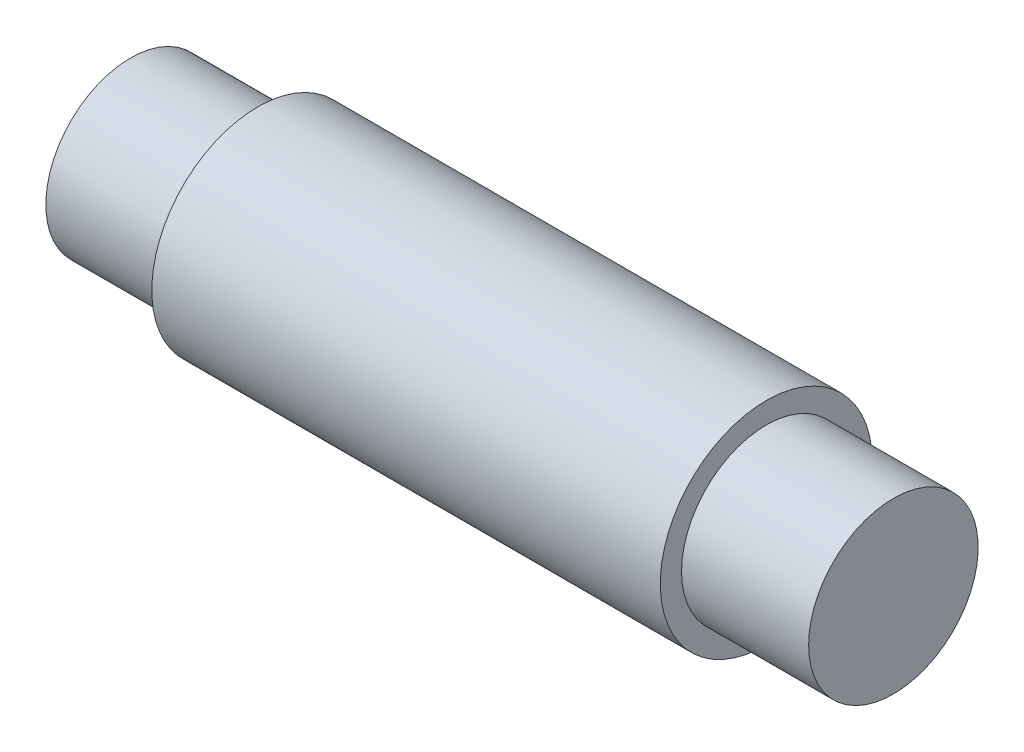
ISO-10303-21;
HEADER;
FILE_DESCRIPTION(('STEP AP214'),'2;1');
FILE_NAME('part.step','',(''),(''),'','','');
FILE_SCHEMA(('AUTOMOTIVE_DESIGN { 1 0 10303 214 1 1 1 1 }'));
ENDSEC;
DATA;
#1=APPLICATION_CONTEXT('core data for automotive mechanical design processes');
#2=APPLICATION_PROTOCOL_DEFINITION('international standard','automotive_design',2000,#1);
#3=PRODUCT_CONTEXT('',#1,'mechanical');
#4=PRODUCT('Part','Part','',(#3));
#5=PRODUCT_RELATED_PRODUCT_CATEGORY('part','',(#4));
#6=PRODUCT_DEFINITION_FORMATION('','',#4);
#7=PRODUCT_DEFINITION_CONTEXT('part definition',#1,'design');
#8=PRODUCT_DEFINITION('design','',#6,#7);
#9=PRODUCT_DEFINITION_SHAPE('','',#8);
#10=(LENGTH_UNIT() NAMED_UNIT(*) SI_UNIT(.MILLI.,.METRE.));
#11=(NAMED_UNIT(*) PLANE_ANGLE_UNIT() SI_UNIT($,.RADIAN.));
#12=(NAMED_UNIT(*) SI_UNIT($,.STERADIAN.) SOLID_ANGLE_UNIT());
#13=UNCERTAINTY_MEASURE_WITH_UNIT(LENGTH_MEASURE(1.E-05),#10,'distance_accuracy_value','');
#14=(GEOMETRIC_REPRESENTATION_CONTEXT(3) GLOBAL_UNCERTAINTY_ASSIGNED_CONTEXT((#13)) GLOBAL_UNIT_ASSIGNED_CONTEXT((#10,
#11,#12)) REPRESENTATION_CONTEXT('',''));
#15=CARTESIAN_POINT('',(0.,0.,0.));
#16=DIRECTION('',(0.,0.,1.));
#17=DIRECTION('',(1.,0.,0.));
#18=AXIS2_PLACEMENT_3D('',#15,#16,#17);
#19=CARTESIAN_POINT('',(2.38125,0.,0.));
#20=DIRECTION('',(-1.,0.,0.));
#21=DIRECTION('',(0.,0.,1.));
#22=AXIS2_PLACEMENT_3D('',#19,#20,#21);
#23=CYLINDRICAL_SURFACE('',#22,3.175);
#24=CARTESIAN_POINT('',(2.38125,0.,0.));
#25=DIRECTION('',(1.,0.,0.));
#26=DIRECTION('',(0.,0.,-1.));
#27=AXIS2_PLACEMENT_3D('',#24,#25,#26);
#28=CIRCLE('',#27,3.175);
#29=CARTESIAN_POINT('',(2.38125,0.,3.175));
#30=VERTEX_POINT('',#29);
#31=EDGE_CURVE('E45',#30,#30,#28,.T.);
#32=CARTESIAN_POINT('',(-2.38125,0.,0.));
#33=DIRECTION('',(1.,0.,0.));
#34=DIRECTION('',(0.,0.,-1.));
#35=AXIS2_PLACEMENT_3D('',#32,#33,#34);
#36=CIRCLE('',#35,3.175);
#37=CARTESIAN_POINT('',(-2.38125,0.,3.175));
#38=VERTEX_POINT('',#37);
#39=EDGE_CURVE('E40',#38,#38,#36,.T.);
#40=CARTESIAN_POINT('',(2.38125,0.,3.175));
#41=CARTESIAN_POINT('',(2.331640625,0.,3.175));
#42=CARTESIAN_POINT('',(2.28203125,0.,3.175));
#43=CARTESIAN_POINT('',(2.1828125,0.,3.175));
#44=CARTESIAN_POINT('',(2.133203125,0.,3.175));
#45=CARTESIAN_POINT('',(2.033984375,0.,3.175));
#46=CARTESIAN_POINT('',(1.984375,0.,3.175));
#47=CARTESIAN_POINT('',(1.88515625,0.,3.175));
#48=CARTESIAN_POINT('',(1.835546875,0.,3.175));
#49=CARTESIAN_POINT('',(1.736328125,0.,3.175));
#50=CARTESIAN_POINT('',(1.68671875,0.,3.175));
#51=CARTESIAN_POINT('',(1.5875,0.,3.175));
#52=CARTESIAN_POINT('',(1.537890625,0.,3.175));
#53=CARTESIAN_POINT('',(1.438671875,0.,3.175));
#54=CARTESIAN_POINT('',(1.3890625,0.,3.175));
#55=CARTESIAN_POINT('',(1.28984375,0.,3.175));
#56=CARTESIAN_POINT('',(1.240234375,0.,3.175));
#57=CARTESIAN_POINT('',(1.141015625,0.,3.175));
#58=CARTESIAN_POINT('',(1.09140625,0.,3.175));
#59=CARTESIAN_POINT('',(0.9921875,0.,3.175));
#60=CARTESIAN_POINT('',(0.942578125,0.,3.175));
#61=CARTESIAN_POINT('',(0.843359375,0.,3.175));
#62=CARTESIAN_POINT('',(0.79375,0.,3.175));
#63=CARTESIAN_POINT('',(0.69453125,0.,3.175));
#64=CARTESIAN_POINT('',(0.644921875,0.,3.175));
#65=CARTESIAN_POINT('',(0.545703125,0.,3.175));
#66=CARTESIAN_POINT('',(0.49609375,0.,3.175));
#67=CARTESIAN_POINT('',(0.396875,0.,3.175));
#68=CARTESIAN_POINT('',(0.347265625,0.,3.175));
#69=CARTESIAN_POINT('',(0.248046875,0.,3.175));
#70=CARTESIAN_POINT('',(0.1984375,0.,3.175));
#71=CARTESIAN_POINT('',(0.0992187499999996,0.,3.175));
#72=CARTESIAN_POINT('',(0.0496093749999996,0.,3.175));
#73=CARTESIAN_POINT('',(-0.0496093750000005,0.,3.175));
#74=CARTESIAN_POINT('',(-0.0992187500000005,0.,3.175));
#75=CARTESIAN_POINT('',(-0.198437500000001,0.,3.175));
#76=CARTESIAN_POINT('',(-0.248046875000001,0.,3.175));
#77=CARTESIAN_POINT('',(-0.347265625000001,0.,3.175));
#78=CARTESIAN_POINT('',(-0.396875000000001,0.,3.175));
#79=CARTESIAN_POINT('',(-0.496093750000001,0.,3.175));
#80=CARTESIAN_POINT('',(-0.545703125000001,0.,3.175));
#81=CARTESIAN_POINT('',(-0.644921875000001,0.,3.175));
#82=CARTESIAN_POINT('',(-0.694531250000001,0.,3.175));
#83=CARTESIAN_POINT('',(-0.793750000000001,0.,3.175));
#84=CARTESIAN_POINT('',(-0.843359375,0.,3.175));
#85=CARTESIAN_POINT('',(-0.942578125000001,0.,3.175));
#86=CARTESIAN_POINT('',(-0.992187500000001,0.,3.175));
#87=CARTESIAN_POINT('',(-1.09140625,0.,3.175));
#88=CARTESIAN_POINT('',(-1.141015625,0.,3.175));
#89=CARTESIAN_POINT('',(-1.240234375,0.,3.175));
#90=CARTESIAN_POINT('',(-1.28984375,0.,3.175));
#91=CARTESIAN_POINT('',(-1.3890625,0.,3.175));
#92=CARTESIAN_POINT('',(-1.438671875,0.,3.175));
#93=CARTESIAN_POINT('',(-1.537890625,0.,3.175));
#94=CARTESIAN_POINT('',(-1.5875,0.,3.175));
#95=CARTESIAN_POINT('',(-1.68671875,0.,3.175));
#96=CARTESIAN_POINT('',(-1.736328125,0.,3.175));
#97=CARTESIAN_POINT('',(-1.835546875,0.,3.175));
#98=CARTESIAN_POINT('',(-1.88515625,0.,3.175));
#99=CARTESIAN_POINT('',(-1.984375,0.,3.175));
#100=CARTESIAN_POINT('',(-2.033984375,0.,3.175));
#101=CARTESIAN_POINT('',(-2.133203125,0.,3.175));
#102=CARTESIAN_POINT('',(-2.1828125,0.,3.175));
#103=CARTESIAN_POINT('',(-2.28203125,0.,3.175));
#104=CARTESIAN_POINT('',(-2.331640625,0.,3.175));
#105=CARTESIAN_POINT('',(-2.38125,0.,3.175));
#106=B_SPLINE_CURVE_WITH_KNOTS('',3,(#40,#41,#42,#43,#44,#45,#46,#47,#48,#49,#50,#51,#52,#53,
#54,#55,#56,#57,#58,#59,#60,#61,#62,#63,#64,#65,#66,#67,#68,#69,#70,#71,#72,#73,#74,#75,#76,#77,
#78,#79,#80,#81,#82,#83,#84,#85,#86,#87,#88,#89,#90,#91,#92,#93,#94,#95,#96,#97,#98,#99,#100,
#101,#102,#103,#104,#105),.UNSPECIFIED.,.F.,.F.,(4,2,2,2,2,2,2,2,2,2,2,2,2,2,2,2,2,2,2,2,2,2,2,
2,2,2,2,2,2,2,2,2,4),(0.,0.148828125,0.29765625,0.446484375,0.5953125,0.744140625,0.89296875,
1.041796875,1.190625,1.339453125,1.48828125,1.637109375,1.7859375,1.934765625,2.08359375,
2.232421875,2.38125,2.530078125,2.67890625,2.827734375,2.9765625,3.125390625,3.27421875,
3.423046875,3.571875,3.720703125,3.86953125,4.018359375,4.1671875,4.316015625,4.46484375,
4.613671875,4.7625),.UNSPECIFIED.);
#107=EDGE_CURVE('BSEAM37',#30,#38,#106,.T.);
#108=ORIENTED_EDGE('',*,*,#31,.F.);
#109=ORIENTED_EDGE('',*,*,#39,.T.);
#110=ORIENTED_EDGE('',*,*,#107,.T.);
#111=ORIENTED_EDGE('',*,*,#107,.F.);
#112=EDGE_LOOP('',(#108,#110,#109,#111));
#113=FACE_BOUND('',#112,.T.);
#114=ADVANCED_FACE('F37',(#113),#23,.T.);
#115=CARTESIAN_POINT('',(2.38125,0.,0.));
#116=DIRECTION('',(1.,0.,0.));
#117=DIRECTION('',(0.,0.,-1.));
#118=AXIS2_PLACEMENT_3D('',#115,#116,#117);
#119=PLANE('',#118);
#120=ORIENTED_EDGE('',*,*,#31,.T.);
#121=EDGE_LOOP('',(#120));
#122=FACE_BOUND('',#121,.T.);
#123=ADVANCED_FACE('F83',(#122),#119,.T.);
#124=CARTESIAN_POINT('',(-21.43125,0.,0.));
#125=DIRECTION('',(1.,0.,0.));
#126=DIRECTION('',(0.,0.,-1.));
#127=AXIS2_PLACEMENT_3D('',#124,#125,#126);
#128=CYLINDRICAL_SURFACE('',#127,3.96875);
#129=CARTESIAN_POINT('',(-21.43125,0.,0.));
#130=DIRECTION('',(-1.,0.,0.));
#131=DIRECTION('',(0.,0.,1.));
#132=AXIS2_PLACEMENT_3D('',#129,#130,#131);
#133=CIRCLE('',#132,3.96875);
#134=CARTESIAN_POINT('',(-21.43125,0.,-3.96875));
#135=VERTEX_POINT('',#134);
#136=EDGE_CURVE('E54',#135,#135,#133,.T.);
#137=CARTESIAN_POINT('',(-2.38125,0.,0.));
#138=DIRECTION('',(-1.,0.,0.));
#139=DIRECTION('',(0.,0.,1.));
#140=AXIS2_PLACEMENT_3D('',#137,#138,#139);
#141=CIRCLE('',#140,3.96875);
#142=CARTESIAN_POINT('',(-2.38125,0.,-3.96875));
#143=VERTEX_POINT('',#142);
#144=EDGE_CURVE('E58',#143,#143,#141,.T.);
#145=CARTESIAN_POINT('',(-21.43125,0.,-3.96875));
#146=CARTESIAN_POINT('',(-21.2328125,0.,-3.96875));
#147=CARTESIAN_POINT('',(-21.034375,0.,-3.96875));
#148=CARTESIAN_POINT('',(-20.6375,0.,-3.96875));
#149=CARTESIAN_POINT('',(-20.4390625,0.,-3.96875));
#150=CARTESIAN_POINT('',(-20.0421875,0.,-3.96875));
#151=CARTESIAN_POINT('',(-19.84375,0.,-3.96875));
#152=CARTESIAN_POINT('',(-19.446875,0.,-3.96875));
#153=CARTESIAN_POINT('',(-19.2484375,0.,-3.96875));
#154=CARTESIAN_POINT('',(-18.8515625,0.,-3.96875));
#155=CARTESIAN_POINT('',(-18.653125,0.,-3.96875));
#156=CARTESIAN_POINT('',(-18.25625,0.,-3.96875));
#157=CARTESIAN_POINT('',(-18.0578125,0.,-3.96875));
#158=CARTESIAN_POINT('',(-17.6609375,0.,-3.96875));
#159=CARTESIAN_POINT('',(-17.4625,0.,-3.96875));
#160=CARTESIAN_POINT('',(-17.065625,0.,-3.96875));
#161=CARTESIAN_POINT('',(-16.8671875,0.,-3.96875));
#162=CARTESIAN_POINT('',(-16.4703125,0.,-3.96875));
#163=CARTESIAN_POINT('',(-16.271875,0.,-3.96875));
#164=CARTESIAN_POINT('',(-15.875,0.,-3.96875));
#165=CARTESIAN_POINT('',(-15.6765625,0.,-3.96875));
#166=CARTESIAN_POINT('',(-15.2796875,0.,-3.96875));
#167=CARTESIAN_POINT('',(-15.08125,0.,-3.96875));
#168=CARTESIAN_POINT('',(-14.684375,0.,-3.96875));
#169=CARTESIAN_POINT('',(-14.4859375,0.,-3.96875));
#170=CARTESIAN_POINT('',(-14.0890625,0.,-3.96875));
#171=CARTESIAN_POINT('',(-13.890625,0.,-3.96875));
#172=CARTESIAN_POINT('',(-13.49375,0.,-3.96875));
#173=CARTESIAN_POINT('',(-13.2953125,0.,-3.96875));
#174=CARTESIAN_POINT('',(-12.8984375,0.,-3.96875));
#175=CARTESIAN_POINT('',(-12.7,0.,-3.96875));
#176=CARTESIAN_POINT('',(-12.303125,0.,-3.96875));
#177=CARTESIAN_POINT('',(-12.1046875,0.,-3.96875));
#178=CARTESIAN_POINT('',(-11.7078125,0.,-3.96875));
#179=CARTESIAN_POINT('',(-11.509375,0.,-3.96875));
#180=CARTESIAN_POINT('',(-11.1125,0.,-3.96875));
#181=CARTESIAN_POINT('',(-10.9140625,0.,-3.96875));
#182=CARTESIAN_POINT('',(-10.5171875,0.,-3.96875));
#183=CARTESIAN_POINT('',(-10.31875,0.,-3.96875));
#184=CARTESIAN_POINT('',(-9.921875,0.,-3.96875));
#185=CARTESIAN_POINT('',(-9.7234375,0.,-3.96875));
#186=CARTESIAN_POINT('',(-9.3265625,0.,-3.96875));
#187=CARTESIAN_POINT('',(-9.128125,0.,-3.96875));
#188=CARTESIAN_POINT('',(-8.73125,0.,-3.96875));
#189=CARTESIAN_POINT('',(-8.5328125,0.,-3.96875));
#190=CARTESIAN_POINT('',(-8.1359375,0.,-3.96875));
#191=CARTESIAN_POINT('',(-7.9375,0.,-3.96875));
#192=CARTESIAN_POINT('',(-7.540625,0.,-3.96875));
#193=CARTESIAN_POINT('',(-7.3421875,0.,-3.96875));
#194=CARTESIAN_POINT('',(-6.9453125,0.,-3.96875));
#195=CARTESIAN_POINT('',(-6.746875,0.,-3.96875));
#196=CARTESIAN_POINT('',(-6.35,0.,-3.96875));
#197=CARTESIAN_POINT('',(-6.1515625,0.,-3.96875));
#198=CARTESIAN_POINT('',(-5.7546875,0.,-3.96875));
#199=CARTESIAN_POINT('',(-5.55625,0.,-3.96875));
#200=CARTESIAN_POINT('',(-5.159375,0.,-3.96875));
#201=CARTESIAN_POINT('',(-4.9609375,0.,-3.96875));
#202=CARTESIAN_POINT('',(-4.5640625,0.,-3.96875));
#203=CARTESIAN_POINT('',(-4.365625,0.,-3.96875));
#204=CARTESIAN_POINT('',(-3.96875,0.,-3.96875));
#205=CARTESIAN_POINT('',(-3.7703125,0.,-3.96875));
#206=CARTESIAN_POINT('',(-3.3734375,0.,-3.96875));
#207=CARTESIAN_POINT('',(-3.175,0.,-3.96875));
#208=CARTESIAN_POINT('',(-2.778125,0.,-3.96875));
#209=CARTESIAN_POINT('',(-2.5796875,0.,-3.96875));
#210=CARTESIAN_POINT('',(-2.38125,0.,-3.96875));
#211=B_SPLINE_CURVE_WITH_KNOTS('',3,(#145,#146,#147,#148,#149,#150,#151,#152,#153,#154,#155,
#156,#157,#158,#159,#160,#161,#162,#163,#164,#165,#166,#167,#168,#169,#170,#171,#172,#173,#174,
#175,#176,#177,#178,#179,#180,#181,#182,#183,#184,#185,#186,#187,#188,#189,#190,#191,#192,#193,
#194,#195,#196,#197,#198,#199,#200,#201,#202,#203,#204,#205,#206,#207,#208,#209,#210),
.UNSPECIFIED.,.F.,.F.,(4,2,2,2,2,2,2,2,2,2,2,2,2,2,2,2,2,2,2,2,2,2,2,2,2,2,2,2,2,2,2,2,4),(0.,
0.5953125,1.190625,1.7859375,2.38125,2.9765625,3.571875,4.1671875,4.7625,5.3578125,5.953125,
6.5484375,7.14375,7.7390625,8.334375,8.9296875,9.525,10.1203125,10.715625,11.3109375,11.90625,
12.5015625,13.096875,13.6921875,14.2875,14.8828125,15.478125,16.0734375,16.66875,17.2640625,
17.859375,18.4546875,19.05),.UNSPECIFIED.);
#212=EDGE_CURVE('BSEAM88',#135,#143,#211,.T.);
#213=ORIENTED_EDGE('',*,*,#136,.F.);
#214=ORIENTED_EDGE('',*,*,#144,.T.);
#215=ORIENTED_EDGE('',*,*,#212,.T.);
#216=ORIENTED_EDGE('',*,*,#212,.F.);
#217=EDGE_LOOP('',(#213,#215,#214,#216));
#218=FACE_BOUND('',#217,.T.);
#219=ADVANCED_FACE('F88',(#218),#128,.T.);
#220=CARTESIAN_POINT('',(-21.43125,0.,0.));
#221=DIRECTION('',(-1.,0.,0.));
#222=DIRECTION('',(0.,0.,1.));
#223=AXIS2_PLACEMENT_3D('',#220,#221,#222);
#224=PLANE('',#223);
#225=CARTESIAN_POINT('',(-21.43125,0.,0.));
#226=DIRECTION('',(-1.,0.,0.));
#227=DIRECTION('',(0.,0.,1.));
#228=AXIS2_PLACEMENT_3D('',#225,#226,#227);
#229=CIRCLE('',#228,3.175);
#230=CARTESIAN_POINT('',(-21.43125,0.,-3.175));
#231=VERTEX_POINT('',#230);
#232=EDGE_CURVE('E10',#231,#231,#229,.T.);
#233=ORIENTED_EDGE('',*,*,#232,.F.);
#234=EDGE_LOOP('',(#233));
#235=FACE_BOUND('',#234,.T.);
#236=ORIENTED_EDGE('',*,*,#136,.T.);
#237=EDGE_LOOP('',(#236));
#238=FACE_BOUND('',#237,.T.);
#239=ADVANCED_FACE('F78',(#235,#238),#224,.T.);
#240=CARTESIAN_POINT('',(-2.38125,0.,0.));
#241=DIRECTION('',(-1.,0.,0.));
#242=DIRECTION('',(0.,0.,1.));
#243=AXIS2_PLACEMENT_3D('',#240,#241,#242);
#244=PLANE('',#243);
#245=ORIENTED_EDGE('',*,*,#39,.F.);
#246=EDGE_LOOP('',(#245));
#247=FACE_BOUND('',#246,.T.);
#248=ORIENTED_EDGE('',*,*,#144,.F.);
#249=EDGE_LOOP('',(#248));
#250=FACE_BOUND('',#249,.T.);
#251=ADVANCED_FACE('F71',(#247,#250),#244,.F.);
#252=CARTESIAN_POINT('',(-26.19375,0.,0.));
#253=DIRECTION('',(1.,0.,0.));
#254=DIRECTION('',(0.,0.,-1.));
#255=AXIS2_PLACEMENT_3D('',#252,#253,#254);
#256=CYLINDRICAL_SURFACE('',#255,3.175);
#257=CARTESIAN_POINT('',(-26.19375,0.,0.));
#258=DIRECTION('',(-1.,0.,0.));
#259=DIRECTION('',(0.,0.,1.));
#260=AXIS2_PLACEMENT_3D('',#257,#258,#259);
#261=CIRCLE('',#260,3.175);
#262=CARTESIAN_POINT('',(-26.19375,0.,-3.175));
#263=VERTEX_POINT('',#262);
#264=EDGE_CURVE('E53',#263,#263,#261,.T.);
#265=CARTESIAN_POINT('',(-26.19375,0.,-3.175));
#266=CARTESIAN_POINT('',(-26.144140625,0.,-3.175));
#267=CARTESIAN_POINT('',(-26.09453125,0.,-3.175));
#268=CARTESIAN_POINT('',(-25.9953125,0.,-3.175));
#269=CARTESIAN_POINT('',(-25.945703125,0.,-3.175));
#270=CARTESIAN_POINT('',(-25.846484375,0.,-3.175));
#271=CARTESIAN_POINT('',(-25.796875,0.,-3.175));
#272=CARTESIAN_POINT('',(-25.69765625,0.,-3.175));
#273=CARTESIAN_POINT('',(-25.648046875,0.,-3.175));
#274=CARTESIAN_POINT('',(-25.548828125,0.,-3.175));
#275=CARTESIAN_POINT('',(-25.49921875,0.,-3.175));
#276=CARTESIAN_POINT('',(-25.4,0.,-3.175));
#277=CARTESIAN_POINT('',(-25.350390625,0.,-3.175));
#278=CARTESIAN_POINT('',(-25.251171875,0.,-3.175));
#279=CARTESIAN_POINT('',(-25.2015625,0.,-3.175));
#280=CARTESIAN_POINT('',(-25.10234375,0.,-3.175));
#281=CARTESIAN_POINT('',(-25.052734375,0.,-3.175));
#282=CARTESIAN_POINT('',(-24.953515625,0.,-3.175));
#283=CARTESIAN_POINT('',(-24.90390625,0.,-3.175));
#284=CARTESIAN_POINT('',(-24.8046875,0.,-3.175));
#285=CARTESIAN_POINT('',(-24.755078125,0.,-3.175));
#286=CARTESIAN_POINT('',(-24.655859375,0.,-3.175));
#287=CARTESIAN_POINT('',(-24.60625,0.,-3.175));
#288=CARTESIAN_POINT('',(-24.50703125,0.,-3.175));
#289=CARTESIAN_POINT('',(-24.457421875,0.,-3.175));
#290=CARTESIAN_POINT('',(-24.358203125,0.,-3.175));
#291=CARTESIAN_POINT('',(-24.30859375,0.,-3.175));
#292=CARTESIAN_POINT('',(-24.209375,0.,-3.175));
#293=CARTESIAN_POINT('',(-24.159765625,0.,-3.175));
#294=CARTESIAN_POINT('',(-24.060546875,0.,-3.175));
#295=CARTESIAN_POINT('',(-24.0109375,0.,-3.175));
#296=CARTESIAN_POINT('',(-23.91171875,0.,-3.175));
#297=CARTESIAN_POINT('',(-23.862109375,0.,-3.175));
#298=CARTESIAN_POINT('',(-23.762890625,0.,-3.175));
#299=CARTESIAN_POINT('',(-23.71328125,0.,-3.175));
#300=CARTESIAN_POINT('',(-23.6140625,0.,-3.175));
#301=CARTESIAN_POINT('',(-23.564453125,0.,-3.175));
#302=CARTESIAN_POINT('',(-23.465234375,0.,-3.175));
#303=CARTESIAN_POINT('',(-23.415625,0.,-3.175));
#304=CARTESIAN_POINT('',(-23.31640625,0.,-3.175));
#305=CARTESIAN_POINT('',(-23.266796875,0.,-3.175));
#306=CARTESIAN_POINT('',(-23.167578125,0.,-3.175));
#307=CARTESIAN_POINT('',(-23.11796875,0.,-3.175));
#308=CARTESIAN_POINT('',(-23.01875,0.,-3.175));
#309=CARTESIAN_POINT('',(-22.969140625,0.,-3.175));
#310=CARTESIAN_POINT('',(-22.869921875,0.,-3.175));
#311=CARTESIAN_POINT('',(-22.8203125,0.,-3.175));
#312=CARTESIAN_POINT('',(-22.72109375,0.,-3.175));
#313=CARTESIAN_POINT('',(-22.671484375,0.,-3.175));
#314=CARTESIAN_POINT('',(-22.572265625,0.,-3.175));
#315=CARTESIAN_POINT('',(-22.52265625,0.,-3.175));
#316=CARTESIAN_POINT('',(-22.4234375,0.,-3.175));
#317=CARTESIAN_POINT('',(-22.373828125,0.,-3.175));
#318=CARTESIAN_POINT('',(-22.274609375,0.,-3.175));
#319=CARTESIAN_POINT('',(-22.225,0.,-3.175));
#320=CARTESIAN_POINT('',(-22.12578125,0.,-3.175));
#321=CARTESIAN_POINT('',(-22.076171875,0.,-3.175));
#322=CARTESIAN_POINT('',(-21.976953125,0.,-3.175));
#323=CARTESIAN_POINT('',(-21.92734375,0.,-3.175));
#324=CARTESIAN_POINT('',(-21.828125,0.,-3.175));
#325=CARTESIAN_POINT('',(-21.778515625,0.,-3.175));
#326=CARTESIAN_POINT('',(-21.679296875,0.,-3.175));
#327=CARTESIAN_POINT('',(-21.6296875,0.,-3.175));
#328=CARTESIAN_POINT('',(-21.53046875,0.,-3.175));
#329=CARTESIAN_POINT('',(-21.480859375,0.,-3.175));
#330=CARTESIAN_POINT('',(-21.43125,0.,-3.175));
#331=B_SPLINE_CURVE_WITH_KNOTS('',3,(#265,#266,#267,#268,#269,#270,#271,#272,#273,#274,#275,
#276,#277,#278,#279,#280,#281,#282,#283,#284,#285,#286,#287,#288,#289,#290,#291,#292,#293,#294,
#295,#296,#297,#298,#299,#300,#301,#302,#303,#304,#305,#306,#307,#308,#309,#310,#311,#312,#313,
#314,#315,#316,#317,#318,#319,#320,#321,#322,#323,#324,#325,#326,#327,#328,#329,#330),
.UNSPECIFIED.,.F.,.F.,(4,2,2,2,2,2,2,2,2,2,2,2,2,2,2,2,2,2,2,2,2,2,2,2,2,2,2,2,2,2,2,2,4),(0.,
0.148828125,0.29765625,0.446484375,0.5953125,0.744140625,0.892968750000001,1.041796875,1.190625,
1.339453125,1.48828125,1.637109375,1.7859375,1.934765625,2.08359375,2.232421875,2.38125,
2.530078125,2.67890625,2.827734375,2.9765625,3.125390625,3.27421875,3.423046875,3.571875,
3.720703125,3.86953125,4.018359375,4.1671875,4.316015625,4.46484375,4.613671875,4.7625),.UNSPECIFIED.);
#332=EDGE_CURVE('BSEAM69',#263,#231,#331,.T.);
#333=ORIENTED_EDGE('',*,*,#264,.F.);
#334=ORIENTED_EDGE('',*,*,#232,.T.);
#335=ORIENTED_EDGE('',*,*,#332,.T.);
#336=ORIENTED_EDGE('',*,*,#332,.F.);
#337=EDGE_LOOP('',(#333,#335,#334,#336));
#338=FACE_BOUND('',#337,.T.);
#339=ADVANCED_FACE('F69',(#338),#256,.T.);
#340=CARTESIAN_POINT('',(-26.19375,0.,0.));
#341=DIRECTION('',(-1.,0.,0.));
#342=DIRECTION('',(0.,0.,1.));
#343=AXIS2_PLACEMENT_3D('',#340,#341,#342);
#344=PLANE('',#343);
#345=ORIENTED_EDGE('',*,*,#264,.T.);
#346=EDGE_LOOP('',(#345));
#347=FACE_BOUND('',#346,.T.);
#348=ADVANCED_FACE('F67',(#347),#344,.T.);
#349=CLOSED_SHELL('',(#114,#123,#219,#239,#251,#339,#348));
#350=MANIFOLD_SOLID_BREP('B2',#349);
#351=ADVANCED_BREP_SHAPE_REPRESENTATION('',(#18,#350),#14);
#352=SHAPE_DEFINITION_REPRESENTATION(#9,#351);
ENDSEC;
END-ISO-10303-21;
